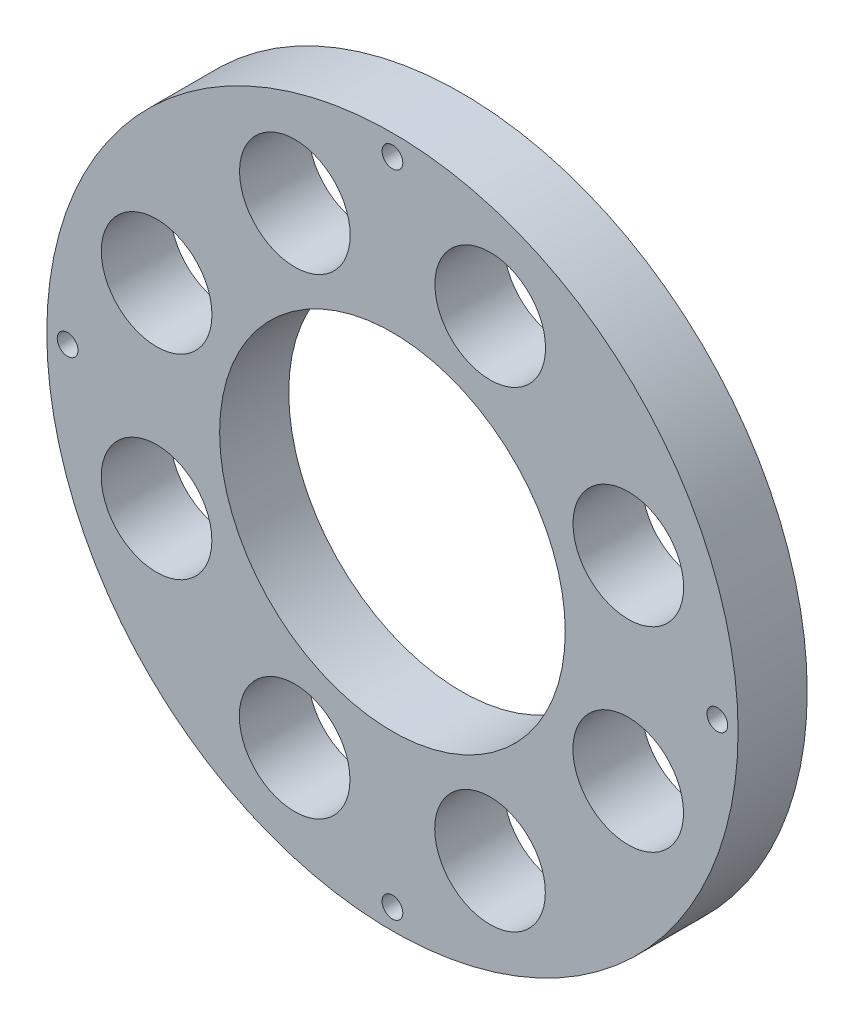
ISO-10303-21;
HEADER;
FILE_DESCRIPTION(('STEP AP214'),'2;1');
FILE_NAME('part.step','',(''),(''),'','','');
FILE_SCHEMA(('AUTOMOTIVE_DESIGN { 1 0 10303 214 1 1 1 1 }'));
ENDSEC;
DATA;
#1=APPLICATION_CONTEXT('core data for automotive mechanical design processes');
#2=APPLICATION_PROTOCOL_DEFINITION('international standard','automotive_design',2000,#1);
#3=PRODUCT_CONTEXT('',#1,'mechanical');
#4=PRODUCT('Part','Part','',(#3));
#5=PRODUCT_RELATED_PRODUCT_CATEGORY('part','',(#4));
#6=PRODUCT_DEFINITION_FORMATION('','',#4);
#7=PRODUCT_DEFINITION_CONTEXT('part definition',#1,'design');
#8=PRODUCT_DEFINITION('design','',#6,#7);
#9=PRODUCT_DEFINITION_SHAPE('','',#8);
#10=(LENGTH_UNIT() NAMED_UNIT(*) SI_UNIT(.MILLI.,.METRE.));
#11=(NAMED_UNIT(*) PLANE_ANGLE_UNIT() SI_UNIT($,.RADIAN.));
#12=(NAMED_UNIT(*) SI_UNIT($,.STERADIAN.) SOLID_ANGLE_UNIT());
#13=UNCERTAINTY_MEASURE_WITH_UNIT(LENGTH_MEASURE(1.E-05),#10,'distance_accuracy_value','');
#14=(GEOMETRIC_REPRESENTATION_CONTEXT(3) GLOBAL_UNCERTAINTY_ASSIGNED_CONTEXT((#13)) GLOBAL_UNIT_ASSIGNED_CONTEXT((#10,
#11,#12)) REPRESENTATION_CONTEXT('',''));
#15=CARTESIAN_POINT('',(0.,0.,0.));
#16=DIRECTION('',(0.,0.,1.));
#17=DIRECTION('',(1.,0.,0.));
#18=AXIS2_PLACEMENT_3D('',#15,#16,#17);
#19=CARTESIAN_POINT('',(0.,0.,10.));
#20=DIRECTION('',(0.,0.,1.));
#21=DIRECTION('',(1.,0.,0.));
#22=AXIS2_PLACEMENT_3D('',#19,#20,#21);
#23=PLANE('',#22);
#24=CARTESIAN_POINT('',(0.,46.99,10.));
#25=DIRECTION('',(0.,0.,1.));
#26=DIRECTION('',(1.,0.,0.));
#27=AXIS2_PLACEMENT_3D('',#24,#25,#26);
#28=CIRCLE('',#27,1.5);
#29=CARTESIAN_POINT('',(1.5,46.99,10.));
#30=VERTEX_POINT('',#29);
#31=EDGE_CURVE('E86',#30,#30,#28,.T.);
#32=ORIENTED_EDGE('',*,*,#31,.F.);
#33=EDGE_LOOP('',(#32));
#34=FACE_BOUND('',#33,.T.);
#35=CARTESIAN_POINT('',(-46.9900000000013,1.32978151082549E-12,10.));
#36=DIRECTION('',(0.,0.,1.));
#37=DIRECTION('',(1.,0.,0.));
#38=AXIS2_PLACEMENT_3D('',#35,#36,#37);
#39=CIRCLE('',#38,1.50000000000104);
#40=CARTESIAN_POINT('',(-45.4900000000003,1.32978151082549E-12,10.));
#41=VERTEX_POINT('',#40);
#42=EDGE_CURVE('E105',#41,#41,#39,.T.);
#43=ORIENTED_EDGE('',*,*,#42,.F.);
#44=EDGE_LOOP('',(#43));
#45=FACE_BOUND('',#44,.T.);
#46=CARTESIAN_POINT('',(-2.65956302165098E-12,-46.99,10.));
#47=DIRECTION('',(0.,0.,1.));
#48=DIRECTION('',(1.,0.,0.));
#49=AXIS2_PLACEMENT_3D('',#46,#47,#48);
#50=CIRCLE('',#49,1.50000000000286);
#51=CARTESIAN_POINT('',(1.5000000000002,-46.99,10.));
#52=VERTEX_POINT('',#51);
#53=EDGE_CURVE('E108',#52,#52,#50,.T.);
#54=ORIENTED_EDGE('',*,*,#53,.F.);
#55=EDGE_LOOP('',(#54));
#56=FACE_BOUND('',#55,.T.);
#57=CARTESIAN_POINT('',(46.9899999999987,-1.33553612613468E-12,10.));
#58=DIRECTION('',(0.,0.,1.));
#59=DIRECTION('',(1.,0.,0.));
#60=AXIS2_PLACEMENT_3D('',#57,#58,#59);
#61=CIRCLE('',#60,1.50000000000214);
#62=CARTESIAN_POINT('',(48.4900000000008,-1.33553612613468E-12,10.));
#63=VERTEX_POINT('',#62);
#64=EDGE_CURVE('E111',#63,#63,#61,.T.);
#65=ORIENTED_EDGE('',*,*,#64,.F.);
#66=EDGE_LOOP('',(#65));
#67=FACE_BOUND('',#66,.T.);
#68=CARTESIAN_POINT('',(34.1220261165839,14.1160551629816,10.));
#69=DIRECTION('',(0.,0.,1.));
#70=DIRECTION('',(1.,0.,0.));
#71=AXIS2_PLACEMENT_3D('',#68,#69,#70);
#72=CIRCLE('',#71,8.00000000000001);
#73=CARTESIAN_POINT('',(42.1220261165839,14.1160551629816,10.));
#74=VERTEX_POINT('',#73);
#75=EDGE_CURVE('E52',#74,#74,#72,.T.);
#76=ORIENTED_EDGE('',*,*,#75,.F.);
#77=EDGE_LOOP('',(#76));
#78=FACE_BOUND('',#77,.T.);
#79=CARTESIAN_POINT('',(34.1094743842074,-14.1463577255162,10.));
#80=DIRECTION('',(0.,0.,1.));
#81=DIRECTION('',(1.,0.,0.));
#82=AXIS2_PLACEMENT_3D('',#79,#80,#81);
#83=CIRCLE('',#82,8.);
#84=CARTESIAN_POINT('',(42.1094743842074,-14.1463577255162,10.));
#85=VERTEX_POINT('',#84);
#86=EDGE_CURVE('E57',#85,#85,#83,.T.);
#87=ORIENTED_EDGE('',*,*,#86,.F.);
#88=EDGE_LOOP('',(#87));
#89=FACE_BOUND('',#88,.T.);
#90=CARTESIAN_POINT('',(14.1160551629774,-34.1220261165881,10.));
#91=DIRECTION('',(0.,0.,1.));
#92=DIRECTION('',(1.,0.,0.));
#93=AXIS2_PLACEMENT_3D('',#90,#91,#92);
#94=CIRCLE('',#93,8.);
#95=CARTESIAN_POINT('',(22.1160551629774,-34.1220261165881,10.));
#96=VERTEX_POINT('',#95);
#97=EDGE_CURVE('E60',#96,#96,#94,.T.);
#98=ORIENTED_EDGE('',*,*,#97,.F.);
#99=EDGE_LOOP('',(#98));
#100=FACE_BOUND('',#99,.T.);
#101=CARTESIAN_POINT('',(-14.1463577255204,-34.1094743842116,10.));
#102=DIRECTION('',(0.,0.,1.));
#103=DIRECTION('',(1.,0.,0.));
#104=AXIS2_PLACEMENT_3D('',#101,#102,#103);
#105=CIRCLE('',#104,8.);
#106=CARTESIAN_POINT('',(-6.14635772552045,-34.1094743842116,10.));
#107=VERTEX_POINT('',#106);
#108=EDGE_CURVE('E63',#107,#107,#105,.T.);
#109=ORIENTED_EDGE('',*,*,#108,.F.);
#110=EDGE_LOOP('',(#109));
#111=FACE_BOUND('',#110,.T.);
#112=CARTESIAN_POINT('',(-34.1220261165923,-14.1160551629816,10.));
#113=DIRECTION('',(0.,0.,1.));
#114=DIRECTION('',(1.,0.,0.));
#115=AXIS2_PLACEMENT_3D('',#112,#113,#114);
#116=CIRCLE('',#115,8.);
#117=CARTESIAN_POINT('',(-26.1220261165923,-14.1160551629816,10.));
#118=VERTEX_POINT('',#117);
#119=EDGE_CURVE('E66',#118,#118,#116,.T.);
#120=ORIENTED_EDGE('',*,*,#119,.F.);
#121=EDGE_LOOP('',(#120));
#122=FACE_BOUND('',#121,.T.);
#123=CARTESIAN_POINT('',(-34.1094743842158,14.1463577255162,10.));
#124=DIRECTION('',(0.,0.,1.));
#125=DIRECTION('',(1.,0.,0.));
#126=AXIS2_PLACEMENT_3D('',#123,#124,#125);
#127=CIRCLE('',#126,8.);
#128=CARTESIAN_POINT('',(-26.1094743842158,14.1463577255162,10.));
#129=VERTEX_POINT('',#128);
#130=EDGE_CURVE('E69',#129,#129,#127,.T.);
#131=ORIENTED_EDGE('',*,*,#130,.F.);
#132=EDGE_LOOP('',(#131));
#133=FACE_BOUND('',#132,.T.);
#134=CARTESIAN_POINT('',(-14.1160551629858,34.1220261165881,10.));
#135=DIRECTION('',(0.,0.,1.));
#136=DIRECTION('',(1.,0.,0.));
#137=AXIS2_PLACEMENT_3D('',#134,#135,#136);
#138=CIRCLE('',#137,8.);
#139=CARTESIAN_POINT('',(-6.11605516298583,34.1220261165881,10.));
#140=VERTEX_POINT('',#139);
#141=EDGE_CURVE('E72',#140,#140,#138,.T.);
#142=ORIENTED_EDGE('',*,*,#141,.F.);
#143=EDGE_LOOP('',(#142));
#144=FACE_BOUND('',#143,.T.);
#145=CARTESIAN_POINT('',(14.146357725512,34.1094743842116,10.));
#146=DIRECTION('',(0.,0.,1.));
#147=DIRECTION('',(1.,0.,0.));
#148=AXIS2_PLACEMENT_3D('',#145,#146,#147);
#149=CIRCLE('',#148,8.);
#150=CARTESIAN_POINT('',(22.146357725512,34.1094743842116,10.));
#151=VERTEX_POINT('',#150);
#152=EDGE_CURVE('E75',#151,#151,#149,.T.);
#153=ORIENTED_EDGE('',*,*,#152,.F.);
#154=EDGE_LOOP('',(#153));
#155=FACE_BOUND('',#154,.T.);
#156=CARTESIAN_POINT('',(0.,0.,10.));
#157=DIRECTION('',(0.,0.,1.));
#158=DIRECTION('',(1.,0.,0.));
#159=AXIS2_PLACEMENT_3D('',#156,#157,#158);
#160=CIRCLE('',#159,50.);
#161=CARTESIAN_POINT('',(50.,0.,10.));
#162=VERTEX_POINT('',#161);
#163=EDGE_CURVE('E10',#162,#162,#160,.T.);
#164=ORIENTED_EDGE('',*,*,#163,.T.);
#165=EDGE_LOOP('',(#164));
#166=FACE_BOUND('',#165,.T.);
#167=CARTESIAN_POINT('',(0.,0.,10.));
#168=DIRECTION('',(0.,0.,1.));
#169=DIRECTION('',(1.,0.,0.));
#170=AXIS2_PLACEMENT_3D('',#167,#168,#169);
#171=CIRCLE('',#170,25.);
#172=CARTESIAN_POINT('',(25.,0.,10.));
#173=VERTEX_POINT('',#172);
#174=EDGE_CURVE('E47',#173,#173,#171,.T.);
#175=ORIENTED_EDGE('',*,*,#174,.F.);
#176=EDGE_LOOP('',(#175));
#177=FACE_BOUND('',#176,.T.);
#178=ADVANCED_FACE('F36',(#34,#45,#56,#67,#78,#89,#100,#111,#122,#133,#144,#155,#166,#177),#23,.T.);
#179=CARTESIAN_POINT('',(0.,0.,0.));
#180=DIRECTION('',(0.,0.,1.));
#181=DIRECTION('',(1.,0.,0.));
#182=AXIS2_PLACEMENT_3D('',#179,#180,#181);
#183=PLANE('',#182);
#184=CARTESIAN_POINT('',(0.,46.99,0.));
#185=DIRECTION('',(0.,0.,-1.));
#186=DIRECTION('',(-1.,0.,0.));
#187=AXIS2_PLACEMENT_3D('',#184,#185,#186);
#188=CIRCLE('',#187,1.5);
#189=CARTESIAN_POINT('',(-1.5,46.99,0.));
#190=VERTEX_POINT('',#189);
#191=EDGE_CURVE('E114',#190,#190,#188,.T.);
#192=ORIENTED_EDGE('',*,*,#191,.F.);
#193=EDGE_LOOP('',(#192));
#194=FACE_BOUND('',#193,.T.);
#195=CARTESIAN_POINT('',(-46.9900000000013,1.32978151082549E-12,0.));
#196=DIRECTION('',(0.,0.,-1.));
#197=DIRECTION('',(-1.,0.,0.));
#198=AXIS2_PLACEMENT_3D('',#195,#196,#197);
#199=CIRCLE('',#198,1.50000000000104);
#200=CARTESIAN_POINT('',(-48.4900000000024,1.32978151082549E-12,0.));
#201=VERTEX_POINT('',#200);
#202=EDGE_CURVE('E121',#201,#201,#199,.T.);
#203=ORIENTED_EDGE('',*,*,#202,.F.);
#204=EDGE_LOOP('',(#203));
#205=FACE_BOUND('',#204,.T.);
#206=CARTESIAN_POINT('',(-2.65956302165098E-12,-46.99,0.));
#207=DIRECTION('',(0.,0.,-1.));
#208=DIRECTION('',(-1.,0.,0.));
#209=AXIS2_PLACEMENT_3D('',#206,#207,#208);
#210=CIRCLE('',#209,1.50000000000286);
#211=CARTESIAN_POINT('',(-1.50000000000552,-46.99,0.));
#212=VERTEX_POINT('',#211);
#213=EDGE_CURVE('E118',#212,#212,#210,.T.);
#214=ORIENTED_EDGE('',*,*,#213,.F.);
#215=EDGE_LOOP('',(#214));
#216=FACE_BOUND('',#215,.T.);
#217=CARTESIAN_POINT('',(46.9899999999987,-1.33553612613468E-12,0.));
#218=DIRECTION('',(0.,0.,-1.));
#219=DIRECTION('',(-1.,0.,0.));
#220=AXIS2_PLACEMENT_3D('',#217,#218,#219);
#221=CIRCLE('',#220,1.50000000000214);
#222=CARTESIAN_POINT('',(45.4899999999965,-1.33553612613468E-12,0.));
#223=VERTEX_POINT('',#222);
#224=EDGE_CURVE('E115',#223,#223,#221,.T.);
#225=ORIENTED_EDGE('',*,*,#224,.F.);
#226=EDGE_LOOP('',(#225));
#227=FACE_BOUND('',#226,.T.);
#228=CARTESIAN_POINT('',(34.1220261165839,14.1160551629816,0.));
#229=DIRECTION('',(0.,0.,-1.));
#230=DIRECTION('',(-1.,0.,0.));
#231=AXIS2_PLACEMENT_3D('',#228,#229,#230);
#232=CIRCLE('',#231,8.00000000000001);
#233=CARTESIAN_POINT('',(26.1220261165839,14.1160551629816,0.));
#234=VERTEX_POINT('',#233);
#235=EDGE_CURVE('E82',#234,#234,#232,.T.);
#236=ORIENTED_EDGE('',*,*,#235,.F.);
#237=EDGE_LOOP('',(#236));
#238=FACE_BOUND('',#237,.T.);
#239=CARTESIAN_POINT('',(34.1094743842074,-14.1463577255162,0.));
#240=DIRECTION('',(0.,0.,-1.));
#241=DIRECTION('',(-1.,0.,0.));
#242=AXIS2_PLACEMENT_3D('',#239,#240,#241);
#243=CIRCLE('',#242,8.);
#244=CARTESIAN_POINT('',(26.1094743842074,-14.1463577255162,0.));
#245=VERTEX_POINT('',#244);
#246=EDGE_CURVE('E85',#245,#245,#243,.T.);
#247=ORIENTED_EDGE('',*,*,#246,.F.);
#248=EDGE_LOOP('',(#247));
#249=FACE_BOUND('',#248,.T.);
#250=CARTESIAN_POINT('',(14.1160551629774,-34.1220261165881,0.));
#251=DIRECTION('',(0.,0.,-1.));
#252=DIRECTION('',(-1.,0.,0.));
#253=AXIS2_PLACEMENT_3D('',#250,#251,#252);
#254=CIRCLE('',#253,8.);
#255=CARTESIAN_POINT('',(6.1160551629774,-34.1220261165881,0.));
#256=VERTEX_POINT('',#255);
#257=EDGE_CURVE('E89',#256,#256,#254,.T.);
#258=ORIENTED_EDGE('',*,*,#257,.F.);
#259=EDGE_LOOP('',(#258));
#260=FACE_BOUND('',#259,.T.);
#261=CARTESIAN_POINT('',(-14.1463577255204,-34.1094743842116,0.));
#262=DIRECTION('',(0.,0.,-1.));
#263=DIRECTION('',(-1.,0.,0.));
#264=AXIS2_PLACEMENT_3D('',#261,#262,#263);
#265=CIRCLE('',#264,8.);
#266=CARTESIAN_POINT('',(-22.1463577255204,-34.1094743842116,0.));
#267=VERTEX_POINT('',#266);
#268=EDGE_CURVE('E92',#267,#267,#265,.T.);
#269=ORIENTED_EDGE('',*,*,#268,.F.);
#270=EDGE_LOOP('',(#269));
#271=FACE_BOUND('',#270,.T.);
#272=CARTESIAN_POINT('',(-34.1220261165923,-14.1160551629816,0.));
#273=DIRECTION('',(0.,0.,-1.));
#274=DIRECTION('',(-1.,0.,0.));
#275=AXIS2_PLACEMENT_3D('',#272,#273,#274);
#276=CIRCLE('',#275,8.);
#277=CARTESIAN_POINT('',(-42.1220261165923,-14.1160551629816,0.));
#278=VERTEX_POINT('',#277);
#279=EDGE_CURVE('E95',#278,#278,#276,.T.);
#280=ORIENTED_EDGE('',*,*,#279,.F.);
#281=EDGE_LOOP('',(#280));
#282=FACE_BOUND('',#281,.T.);
#283=CARTESIAN_POINT('',(-34.1094743842158,14.1463577255162,0.));
#284=DIRECTION('',(0.,0.,-1.));
#285=DIRECTION('',(-1.,0.,0.));
#286=AXIS2_PLACEMENT_3D('',#283,#284,#285);
#287=CIRCLE('',#286,8.);
#288=CARTESIAN_POINT('',(-42.1094743842158,14.1463577255162,0.));
#289=VERTEX_POINT('',#288);
#290=EDGE_CURVE('E98',#289,#289,#287,.T.);
#291=ORIENTED_EDGE('',*,*,#290,.F.);
#292=EDGE_LOOP('',(#291));
#293=FACE_BOUND('',#292,.T.);
#294=CARTESIAN_POINT('',(-14.1160551629858,34.1220261165881,0.));
#295=DIRECTION('',(0.,0.,-1.));
#296=DIRECTION('',(-1.,0.,0.));
#297=AXIS2_PLACEMENT_3D('',#294,#295,#296);
#298=CIRCLE('',#297,8.);
#299=CARTESIAN_POINT('',(-22.1160551629858,34.1220261165881,0.));
#300=VERTEX_POINT('',#299);
#301=EDGE_CURVE('E81',#300,#300,#298,.T.);
#302=ORIENTED_EDGE('',*,*,#301,.F.);
#303=EDGE_LOOP('',(#302));
#304=FACE_BOUND('',#303,.T.);
#305=CARTESIAN_POINT('',(14.146357725512,34.1094743842116,0.));
#306=DIRECTION('',(0.,0.,-1.));
#307=DIRECTION('',(-1.,0.,0.));
#308=AXIS2_PLACEMENT_3D('',#305,#306,#307);
#309=CIRCLE('',#308,8.);
#310=CARTESIAN_POINT('',(6.14635772551202,34.1094743842116,0.));
#311=VERTEX_POINT('',#310);
#312=EDGE_CURVE('E78',#311,#311,#309,.T.);
#313=ORIENTED_EDGE('',*,*,#312,.F.);
#314=EDGE_LOOP('',(#313));
#315=FACE_BOUND('',#314,.T.);
#316=CARTESIAN_POINT('',(0.,0.,0.));
#317=DIRECTION('',(0.,0.,1.));
#318=DIRECTION('',(1.,0.,0.));
#319=AXIS2_PLACEMENT_3D('',#316,#317,#318);
#320=CIRCLE('',#319,50.);
#321=CARTESIAN_POINT('',(50.,0.,0.));
#322=VERTEX_POINT('',#321);
#323=EDGE_CURVE('E40',#322,#322,#320,.T.);
#324=ORIENTED_EDGE('',*,*,#323,.F.);
#325=EDGE_LOOP('',(#324));
#326=FACE_BOUND('',#325,.T.);
#327=CARTESIAN_POINT('',(0.,0.,0.));
#328=DIRECTION('',(0.,0.,1.));
#329=DIRECTION('',(1.,0.,0.));
#330=AXIS2_PLACEMENT_3D('',#327,#328,#329);
#331=CIRCLE('',#330,25.);
#332=CARTESIAN_POINT('',(25.,0.,0.));
#333=VERTEX_POINT('',#332);
#334=EDGE_CURVE('E49',#333,#333,#331,.T.);
#335=ORIENTED_EDGE('',*,*,#334,.T.);
#336=EDGE_LOOP('',(#335));
#337=FACE_BOUND('',#336,.T.);
#338=ADVANCED_FACE('F129',(#194,#205,#216,#227,#238,#249,#260,#271,#282,#293,#304,#315,#326,
#337),#183,.F.);
#339=CARTESIAN_POINT('',(0.,0.,10.));
#340=DIRECTION('',(0.,0.,-1.));
#341=DIRECTION('',(-1.,0.,0.));
#342=AXIS2_PLACEMENT_3D('',#339,#340,#341);
#343=CYLINDRICAL_SURFACE('',#342,50.);
#344=ORIENTED_EDGE('',*,*,#163,.F.);
#345=EDGE_LOOP('',(#344));
#346=FACE_BOUND('',#345,.T.);
#347=ORIENTED_EDGE('',*,*,#323,.T.);
#348=EDGE_LOOP('',(#347));
#349=FACE_BOUND('',#348,.T.);
#350=ADVANCED_FACE('F38',(#346,#349),#343,.T.);
#351=CARTESIAN_POINT('',(0.,0.,10.));
#352=DIRECTION('',(0.,0.,-1.));
#353=DIRECTION('',(-1.,0.,0.));
#354=AXIS2_PLACEMENT_3D('',#351,#352,#353);
#355=CYLINDRICAL_SURFACE('',#354,25.);
#356=ORIENTED_EDGE('',*,*,#174,.T.);
#357=EDGE_LOOP('',(#356));
#358=FACE_BOUND('',#357,.T.);
#359=ORIENTED_EDGE('',*,*,#334,.F.);
#360=EDGE_LOOP('',(#359));
#361=FACE_BOUND('',#360,.T.);
#362=ADVANCED_FACE('F158',(#358,#361),#355,.F.);
#363=CARTESIAN_POINT('',(14.146357725512,34.1094743842116,20.));
#364=DIRECTION('',(0.,0.,-1.));
#365=DIRECTION('',(-1.,0.,0.));
#366=AXIS2_PLACEMENT_3D('',#363,#364,#365);
#367=CYLINDRICAL_SURFACE('',#366,8.);
#368=ORIENTED_EDGE('',*,*,#152,.T.);
#369=EDGE_LOOP('',(#368));
#370=FACE_BOUND('',#369,.T.);
#371=ORIENTED_EDGE('',*,*,#312,.T.);
#372=EDGE_LOOP('',(#371));
#373=FACE_BOUND('',#372,.T.);
#374=ADVANCED_FACE('F160',(#370,#373),#367,.F.);
#375=CARTESIAN_POINT('',(-14.1160551629858,34.1220261165881,20.));
#376=DIRECTION('',(0.,0.,-1.));
#377=DIRECTION('',(-1.,0.,0.));
#378=AXIS2_PLACEMENT_3D('',#375,#376,#377);
#379=CYLINDRICAL_SURFACE('',#378,8.);
#380=ORIENTED_EDGE('',*,*,#141,.T.);
#381=EDGE_LOOP('',(#380));
#382=FACE_BOUND('',#381,.T.);
#383=ORIENTED_EDGE('',*,*,#301,.T.);
#384=EDGE_LOOP('',(#383));
#385=FACE_BOUND('',#384,.T.);
#386=ADVANCED_FACE('F167',(#382,#385),#379,.F.);
#387=CARTESIAN_POINT('',(-34.1094743842158,14.1463577255162,20.));
#388=DIRECTION('',(0.,0.,-1.));
#389=DIRECTION('',(-1.,0.,0.));
#390=AXIS2_PLACEMENT_3D('',#387,#388,#389);
#391=CYLINDRICAL_SURFACE('',#390,8.);
#392=ORIENTED_EDGE('',*,*,#130,.T.);
#393=EDGE_LOOP('',(#392));
#394=FACE_BOUND('',#393,.T.);
#395=ORIENTED_EDGE('',*,*,#290,.T.);
#396=EDGE_LOOP('',(#395));
#397=FACE_BOUND('',#396,.T.);
#398=ADVANCED_FACE('F206',(#394,#397),#391,.F.);
#399=CARTESIAN_POINT('',(-34.1220261165923,-14.1160551629816,20.));
#400=DIRECTION('',(0.,0.,-1.));
#401=DIRECTION('',(-1.,0.,0.));
#402=AXIS2_PLACEMENT_3D('',#399,#400,#401);
#403=CYLINDRICAL_SURFACE('',#402,8.);
#404=ORIENTED_EDGE('',*,*,#119,.T.);
#405=EDGE_LOOP('',(#404));
#406=FACE_BOUND('',#405,.T.);
#407=ORIENTED_EDGE('',*,*,#279,.T.);
#408=EDGE_LOOP('',(#407));
#409=FACE_BOUND('',#408,.T.);
#410=ADVANCED_FACE('F211',(#406,#409),#403,.F.);
#411=CARTESIAN_POINT('',(-14.1463577255204,-34.1094743842116,20.));
#412=DIRECTION('',(0.,0.,-1.));
#413=DIRECTION('',(-1.,0.,0.));
#414=AXIS2_PLACEMENT_3D('',#411,#412,#413);
#415=CYLINDRICAL_SURFACE('',#414,8.);
#416=ORIENTED_EDGE('',*,*,#108,.T.);
#417=EDGE_LOOP('',(#416));
#418=FACE_BOUND('',#417,.T.);
#419=ORIENTED_EDGE('',*,*,#268,.T.);
#420=EDGE_LOOP('',(#419));
#421=FACE_BOUND('',#420,.T.);
#422=ADVANCED_FACE('F220',(#418,#421),#415,.F.);
#423=CARTESIAN_POINT('',(14.1160551629774,-34.1220261165881,20.));
#424=DIRECTION('',(0.,0.,-1.));
#425=DIRECTION('',(-1.,0.,0.));
#426=AXIS2_PLACEMENT_3D('',#423,#424,#425);
#427=CYLINDRICAL_SURFACE('',#426,8.);
#428=ORIENTED_EDGE('',*,*,#97,.T.);
#429=EDGE_LOOP('',(#428));
#430=FACE_BOUND('',#429,.T.);
#431=ORIENTED_EDGE('',*,*,#257,.T.);
#432=EDGE_LOOP('',(#431));
#433=FACE_BOUND('',#432,.T.);
#434=ADVANCED_FACE('F224',(#430,#433),#427,.F.);
#435=CARTESIAN_POINT('',(34.1094743842074,-14.1463577255162,20.));
#436=DIRECTION('',(0.,0.,-1.));
#437=DIRECTION('',(-1.,0.,0.));
#438=AXIS2_PLACEMENT_3D('',#435,#436,#437);
#439=CYLINDRICAL_SURFACE('',#438,8.);
#440=ORIENTED_EDGE('',*,*,#86,.T.);
#441=EDGE_LOOP('',(#440));
#442=FACE_BOUND('',#441,.T.);
#443=ORIENTED_EDGE('',*,*,#246,.T.);
#444=EDGE_LOOP('',(#443));
#445=FACE_BOUND('',#444,.T.);
#446=ADVANCED_FACE('F228',(#442,#445),#439,.F.);
#447=CARTESIAN_POINT('',(34.1220261165839,14.1160551629816,20.));
#448=DIRECTION('',(0.,0.,-1.));
#449=DIRECTION('',(-1.,0.,0.));
#450=AXIS2_PLACEMENT_3D('',#447,#448,#449);
#451=CYLINDRICAL_SURFACE('',#450,8.00000000000001);
#452=ORIENTED_EDGE('',*,*,#75,.T.);
#453=EDGE_LOOP('',(#452));
#454=FACE_BOUND('',#453,.T.);
#455=ORIENTED_EDGE('',*,*,#235,.T.);
#456=EDGE_LOOP('',(#455));
#457=FACE_BOUND('',#456,.T.);
#458=ADVANCED_FACE('F232',(#454,#457),#451,.F.);
#459=CARTESIAN_POINT('',(46.9899999999987,-1.33553612613468E-12,30.));
#460=DIRECTION('',(0.,0.,-1.));
#461=DIRECTION('',(-1.,0.,0.));
#462=AXIS2_PLACEMENT_3D('',#459,#460,#461);
#463=CYLINDRICAL_SURFACE('',#462,1.50000000000214);
#464=ORIENTED_EDGE('',*,*,#64,.T.);
#465=EDGE_LOOP('',(#464));
#466=FACE_BOUND('',#465,.T.);
#467=ORIENTED_EDGE('',*,*,#224,.T.);
#468=EDGE_LOOP('',(#467));
#469=FACE_BOUND('',#468,.T.);
#470=ADVANCED_FACE('F215',(#466,#469),#463,.F.);
#471=CARTESIAN_POINT('',(-2.65956302165098E-12,-46.99,30.));
#472=DIRECTION('',(0.,0.,-1.));
#473=DIRECTION('',(-1.,0.,0.));
#474=AXIS2_PLACEMENT_3D('',#471,#472,#473);
#475=CYLINDRICAL_SURFACE('',#474,1.50000000000286);
#476=ORIENTED_EDGE('',*,*,#53,.T.);
#477=EDGE_LOOP('',(#476));
#478=FACE_BOUND('',#477,.T.);
#479=ORIENTED_EDGE('',*,*,#213,.T.);
#480=EDGE_LOOP('',(#479));
#481=FACE_BOUND('',#480,.T.);
#482=ADVANCED_FACE('F238',(#478,#481),#475,.F.);
#483=CARTESIAN_POINT('',(-46.9900000000013,1.32978151082549E-12,30.));
#484=DIRECTION('',(0.,0.,-1.));
#485=DIRECTION('',(-1.,0.,0.));
#486=AXIS2_PLACEMENT_3D('',#483,#484,#485);
#487=CYLINDRICAL_SURFACE('',#486,1.50000000000104);
#488=ORIENTED_EDGE('',*,*,#42,.T.);
#489=EDGE_LOOP('',(#488));
#490=FACE_BOUND('',#489,.T.);
#491=ORIENTED_EDGE('',*,*,#202,.T.);
#492=EDGE_LOOP('',(#491));
#493=FACE_BOUND('',#492,.T.);
#494=ADVANCED_FACE('F244',(#490,#493),#487,.F.);
#495=CARTESIAN_POINT('',(0.,46.99,30.));
#496=DIRECTION('',(0.,0.,-1.));
#497=DIRECTION('',(-1.,0.,0.));
#498=AXIS2_PLACEMENT_3D('',#495,#496,#497);
#499=CYLINDRICAL_SURFACE('',#498,1.5);
#500=ORIENTED_EDGE('',*,*,#31,.T.);
#501=EDGE_LOOP('',(#500));
#502=FACE_BOUND('',#501,.T.);
#503=ORIENTED_EDGE('',*,*,#191,.T.);
#504=EDGE_LOOP('',(#503));
#505=FACE_BOUND('',#504,.T.);
#506=ADVANCED_FACE('F127',(#502,#505),#499,.F.);
#507=CLOSED_SHELL('',(#178,#338,#350,#362,#374,#386,#398,#410,#422,#434,#446,#458,#470,#482,
#494,#506));
#508=MANIFOLD_SOLID_BREP('B2',#507);
#509=ADVANCED_BREP_SHAPE_REPRESENTATION('',(#18,#508),#14);
#510=SHAPE_DEFINITION_REPRESENTATION(#9,#509);
ENDSEC;
END-ISO-10303-21;
